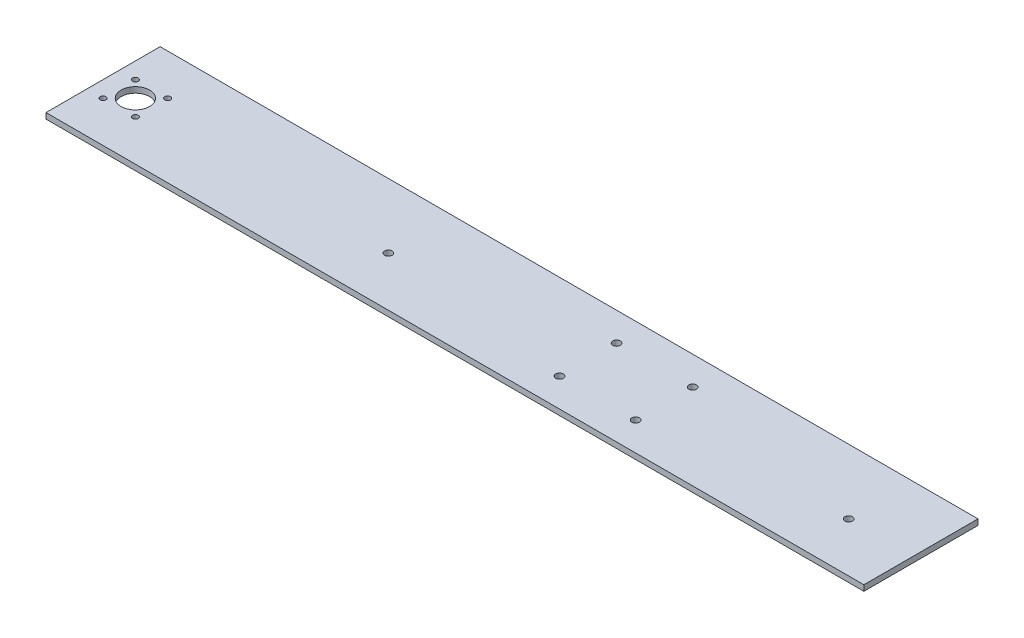
ISO-10303-21;
HEADER;
FILE_DESCRIPTION(('STEP AP214'),'2;1');
FILE_NAME('part.step','',(''),(''),'','','');
FILE_SCHEMA(('AUTOMOTIVE_DESIGN { 1 0 10303 214 1 1 1 1 }'));
ENDSEC;
DATA;
#1=APPLICATION_CONTEXT('core data for automotive mechanical design processes');
#2=APPLICATION_PROTOCOL_DEFINITION('international standard','automotive_design',2000,#1);
#3=PRODUCT_CONTEXT('',#1,'mechanical');
#4=PRODUCT('Part','Part','',(#3));
#5=PRODUCT_RELATED_PRODUCT_CATEGORY('part','',(#4));
#6=PRODUCT_DEFINITION_FORMATION('','',#4);
#7=PRODUCT_DEFINITION_CONTEXT('part definition',#1,'design');
#8=PRODUCT_DEFINITION('design','',#6,#7);
#9=PRODUCT_DEFINITION_SHAPE('','',#8);
#10=(LENGTH_UNIT() NAMED_UNIT(*) SI_UNIT(.MILLI.,.METRE.));
#11=(NAMED_UNIT(*) PLANE_ANGLE_UNIT() SI_UNIT($,.RADIAN.));
#12=(NAMED_UNIT(*) SI_UNIT($,.STERADIAN.) SOLID_ANGLE_UNIT());
#13=UNCERTAINTY_MEASURE_WITH_UNIT(LENGTH_MEASURE(1.E-05),#10,'distance_accuracy_value','');
#14=(GEOMETRIC_REPRESENTATION_CONTEXT(3) GLOBAL_UNCERTAINTY_ASSIGNED_CONTEXT((#13)) GLOBAL_UNIT_ASSIGNED_CONTEXT((#10,
#11,#12)) REPRESENTATION_CONTEXT('',''));
#15=CARTESIAN_POINT('',(0.,0.,0.));
#16=DIRECTION('',(0.,0.,1.));
#17=DIRECTION('',(1.,0.,0.));
#18=AXIS2_PLACEMENT_3D('',#15,#16,#17);
#19=CARTESIAN_POINT('',(-130.,3.,0.));
#20=DIRECTION('',(1.,0.,0.));
#21=DIRECTION('',(0.,0.,-1.));
#22=AXIS2_PLACEMENT_3D('',#19,#20,#21);
#23=PLANE('',#22);
#24=DIRECTION('',(0.,0.,1.));
#25=VECTOR('',#24,1.);
#26=CARTESIAN_POINT('',(-130.,0.,0.));
#27=LINE('',#26,#25);
#28=CARTESIAN_POINT('',(-130.,0.,-60.));
#29=VERTEX_POINT('',#28);
#30=CARTESIAN_POINT('',(-130.,0.,0.));
#31=VERTEX_POINT('',#30);
#32=EDGE_CURVE('E103',#29,#31,#27,.T.);
#33=ORIENTED_EDGE('',*,*,#32,.T.);
#34=DIRECTION('',(0.,-1.,0.));
#35=VECTOR('',#34,1.);
#36=CARTESIAN_POINT('',(-130.,3.,0.));
#37=LINE('',#36,#35);
#38=CARTESIAN_POINT('',(-130.,3.,0.));
#39=VERTEX_POINT('',#38);
#40=EDGE_CURVE('E11',#39,#31,#37,.T.);
#41=ORIENTED_EDGE('',*,*,#40,.F.);
#42=DIRECTION('',(0.,0.,1.));
#43=VECTOR('',#42,1.);
#44=CARTESIAN_POINT('',(-130.,3.,0.));
#45=LINE('',#44,#43);
#46=CARTESIAN_POINT('',(-130.,3.,-60.));
#47=VERTEX_POINT('',#46);
#48=EDGE_CURVE('E90',#47,#39,#45,.T.);
#49=ORIENTED_EDGE('',*,*,#48,.F.);
#50=DIRECTION('',(0.,-1.,0.));
#51=VECTOR('',#50,1.);
#52=CARTESIAN_POINT('',(-130.,3.,-60.));
#53=LINE('',#52,#51);
#54=EDGE_CURVE('E99',#47,#29,#53,.T.);
#55=ORIENTED_EDGE('',*,*,#54,.T.);
#56=EDGE_LOOP('',(#33,#41,#49,#55));
#57=FACE_BOUND('',#56,.T.);
#58=ADVANCED_FACE('F37',(#57),#23,.F.);
#59=CARTESIAN_POINT('',(-130.,3.,0.));
#60=DIRECTION('',(0.,0.,-1.));
#61=DIRECTION('',(-1.,0.,0.));
#62=AXIS2_PLACEMENT_3D('',#59,#60,#61);
#63=PLANE('',#62);
#64=DIRECTION('',(1.,0.,0.));
#65=VECTOR('',#64,1.);
#66=CARTESIAN_POINT('',(-130.,0.,0.));
#67=LINE('',#66,#65);
#68=CARTESIAN_POINT('',(300.,0.,0.));
#69=VERTEX_POINT('',#68);
#70=EDGE_CURVE('E94',#31,#69,#67,.T.);
#71=ORIENTED_EDGE('',*,*,#70,.T.);
#72=DIRECTION('',(0.,-1.,0.));
#73=VECTOR('',#72,1.);
#74=CARTESIAN_POINT('',(300.,3.,0.));
#75=LINE('',#74,#73);
#76=CARTESIAN_POINT('',(300.,3.,0.));
#77=VERTEX_POINT('',#76);
#78=EDGE_CURVE('E46',#77,#69,#75,.T.);
#79=ORIENTED_EDGE('',*,*,#78,.F.);
#80=DIRECTION('',(1.,0.,0.));
#81=VECTOR('',#80,1.);
#82=CARTESIAN_POINT('',(-130.,3.,0.));
#83=LINE('',#82,#81);
#84=EDGE_CURVE('E85',#39,#77,#83,.T.);
#85=ORIENTED_EDGE('',*,*,#84,.F.);
#86=ORIENTED_EDGE('',*,*,#40,.T.);
#87=EDGE_LOOP('',(#71,#79,#85,#86));
#88=FACE_BOUND('',#87,.T.);
#89=ADVANCED_FACE('F93',(#88),#63,.F.);
#90=CARTESIAN_POINT('',(300.,3.,0.));
#91=DIRECTION('',(-1.,0.,0.));
#92=DIRECTION('',(0.,0.,1.));
#93=AXIS2_PLACEMENT_3D('',#90,#91,#92);
#94=PLANE('',#93);
#95=DIRECTION('',(0.,0.,-1.));
#96=VECTOR('',#95,1.);
#97=CARTESIAN_POINT('',(300.,0.,0.));
#98=LINE('',#97,#96);
#99=CARTESIAN_POINT('',(300.,0.,-60.));
#100=VERTEX_POINT('',#99);
#101=EDGE_CURVE('E72',#69,#100,#98,.T.);
#102=ORIENTED_EDGE('',*,*,#101,.T.);
#103=DIRECTION('',(0.,-1.,0.));
#104=VECTOR('',#103,1.);
#105=CARTESIAN_POINT('',(300.,3.,-60.));
#106=LINE('',#105,#104);
#107=CARTESIAN_POINT('',(300.,3.,-60.));
#108=VERTEX_POINT('',#107);
#109=EDGE_CURVE('E95',#108,#100,#106,.T.);
#110=ORIENTED_EDGE('',*,*,#109,.F.);
#111=DIRECTION('',(0.,0.,-1.));
#112=VECTOR('',#111,1.);
#113=CARTESIAN_POINT('',(300.,3.,0.));
#114=LINE('',#113,#112);
#115=EDGE_CURVE('E88',#77,#108,#114,.T.);
#116=ORIENTED_EDGE('',*,*,#115,.F.);
#117=ORIENTED_EDGE('',*,*,#78,.T.);
#118=EDGE_LOOP('',(#102,#110,#116,#117));
#119=FACE_BOUND('',#118,.T.);
#120=ADVANCED_FACE('F97',(#119),#94,.F.);
#121=CARTESIAN_POINT('',(-130.,3.,-60.));
#122=DIRECTION('',(0.,0.,1.));
#123=DIRECTION('',(1.,0.,0.));
#124=AXIS2_PLACEMENT_3D('',#121,#122,#123);
#125=PLANE('',#124);
#126=DIRECTION('',(-1.,0.,0.));
#127=VECTOR('',#126,1.);
#128=CARTESIAN_POINT('',(-130.,0.,-60.));
#129=LINE('',#128,#127);
#130=EDGE_CURVE('E78',#100,#29,#129,.T.);
#131=ORIENTED_EDGE('',*,*,#130,.T.);
#132=ORIENTED_EDGE('',*,*,#54,.F.);
#133=DIRECTION('',(-1.,0.,0.));
#134=VECTOR('',#133,1.);
#135=CARTESIAN_POINT('',(-130.,3.,-60.));
#136=LINE('',#135,#134);
#137=EDGE_CURVE('E55',#108,#47,#136,.T.);
#138=ORIENTED_EDGE('',*,*,#137,.F.);
#139=ORIENTED_EDGE('',*,*,#109,.T.);
#140=EDGE_LOOP('',(#131,#132,#138,#139));
#141=FACE_BOUND('',#140,.T.);
#142=ADVANCED_FACE('F189',(#141),#125,.F.);
#143=CARTESIAN_POINT('',(0.,3.,0.));
#144=DIRECTION('',(0.,-1.,0.));
#145=DIRECTION('',(0.,0.,-1.));
#146=AXIS2_PLACEMENT_3D('',#143,#144,#145);
#147=PLANE('',#146);
#148=CARTESIAN_POINT('',(-121.485281374238,3.,-21.5147186257613));
#149=DIRECTION('',(0.,1.,0.));
#150=DIRECTION('',(0.,0.,1.));
#151=AXIS2_PLACEMENT_3D('',#148,#149,#150);
#152=CIRCLE('',#151,1.5);
#153=CARTESIAN_POINT('',(-121.485281374238,3.,-20.0147186257613));
#154=VERTEX_POINT('',#153);
#155=EDGE_CURVE('E136',#154,#154,#152,.T.);
#156=ORIENTED_EDGE('',*,*,#155,.F.);
#157=EDGE_LOOP('',(#156));
#158=FACE_BOUND('',#157,.T.);
#159=CARTESIAN_POINT('',(-121.485281374238,3.,-38.4852813742384));
#160=DIRECTION('',(0.,1.,0.));
#161=DIRECTION('',(0.,0.,1.));
#162=AXIS2_PLACEMENT_3D('',#159,#160,#161);
#163=CIRCLE('',#162,1.5);
#164=CARTESIAN_POINT('',(-121.485281374238,3.,-36.9852813742384));
#165=VERTEX_POINT('',#164);
#166=EDGE_CURVE('E126',#165,#165,#163,.T.);
#167=ORIENTED_EDGE('',*,*,#166,.F.);
#168=EDGE_LOOP('',(#167));
#169=FACE_BOUND('',#168,.T.);
#170=CARTESIAN_POINT('',(-104.514718625761,3.,-21.5147186257615));
#171=DIRECTION('',(0.,1.,0.));
#172=DIRECTION('',(0.,0.,1.));
#173=AXIS2_PLACEMENT_3D('',#170,#171,#172);
#174=CIRCLE('',#173,1.5);
#175=CARTESIAN_POINT('',(-104.514718625761,3.,-20.0147186257615));
#176=VERTEX_POINT('',#175);
#177=EDGE_CURVE('E123',#176,#176,#174,.T.);
#178=ORIENTED_EDGE('',*,*,#177,.F.);
#179=EDGE_LOOP('',(#178));
#180=FACE_BOUND('',#179,.T.);
#181=CARTESIAN_POINT('',(-104.514718625761,3.,-38.4852813742386));
#182=DIRECTION('',(0.,1.,0.));
#183=DIRECTION('',(0.,0.,1.));
#184=AXIS2_PLACEMENT_3D('',#181,#182,#183);
#185=CIRCLE('',#184,1.5);
#186=CARTESIAN_POINT('',(-104.514718625761,3.,-36.9852813742386));
#187=VERTEX_POINT('',#186);
#188=EDGE_CURVE('E120',#187,#187,#185,.T.);
#189=ORIENTED_EDGE('',*,*,#188,.F.);
#190=EDGE_LOOP('',(#189));
#191=FACE_BOUND('',#190,.T.);
#192=CARTESIAN_POINT('',(-113.,3.,-30.));
#193=DIRECTION('',(0.,1.,0.));
#194=DIRECTION('',(0.,0.,1.));
#195=AXIS2_PLACEMENT_3D('',#192,#193,#194);
#196=CIRCLE('',#195,7.50000000000001);
#197=CARTESIAN_POINT('',(-113.,3.,-22.5));
#198=VERTEX_POINT('',#197);
#199=EDGE_CURVE('E116',#198,#198,#196,.T.);
#200=ORIENTED_EDGE('',*,*,#199,.F.);
#201=EDGE_LOOP('',(#200));
#202=FACE_BOUND('',#201,.T.);
#203=CARTESIAN_POINT('',(266.,3.,-26.));
#204=DIRECTION('',(0.,1.,0.));
#205=DIRECTION('',(0.,0.,1.));
#206=AXIS2_PLACEMENT_3D('',#203,#204,#205);
#207=CIRCLE('',#206,2.);
#208=CARTESIAN_POINT('',(266.,3.,-24.));
#209=VERTEX_POINT('',#208);
#210=EDGE_CURVE('E115',#209,#209,#207,.T.);
#211=ORIENTED_EDGE('',*,*,#210,.F.);
#212=EDGE_LOOP('',(#211));
#213=FACE_BOUND('',#212,.T.);
#214=CARTESIAN_POINT('',(24.,3.,-26.));
#215=DIRECTION('',(0.,1.,0.));
#216=DIRECTION('',(0.,0.,1.));
#217=AXIS2_PLACEMENT_3D('',#214,#215,#216);
#218=CIRCLE('',#217,2.);
#219=CARTESIAN_POINT('',(24.,3.,-24.));
#220=VERTEX_POINT('',#219);
#221=EDGE_CURVE('E148',#220,#220,#218,.T.);
#222=ORIENTED_EDGE('',*,*,#221,.F.);
#223=EDGE_LOOP('',(#222));
#224=FACE_BOUND('',#223,.T.);
#225=CARTESIAN_POINT('',(125.,3.,-15.));
#226=DIRECTION('',(0.,1.,0.));
#227=DIRECTION('',(0.,0.,1.));
#228=AXIS2_PLACEMENT_3D('',#225,#226,#227);
#229=CIRCLE('',#228,2.);
#230=CARTESIAN_POINT('',(125.,3.,-13.));
#231=VERTEX_POINT('',#230);
#232=EDGE_CURVE('E154',#231,#231,#229,.T.);
#233=ORIENTED_EDGE('',*,*,#232,.F.);
#234=EDGE_LOOP('',(#233));
#235=FACE_BOUND('',#234,.T.);
#236=CARTESIAN_POINT('',(165.,3.,-15.));
#237=DIRECTION('',(0.,1.,0.));
#238=DIRECTION('',(0.,0.,1.));
#239=AXIS2_PLACEMENT_3D('',#236,#237,#238);
#240=CIRCLE('',#239,2.);
#241=CARTESIAN_POINT('',(165.,3.,-13.));
#242=VERTEX_POINT('',#241);
#243=EDGE_CURVE('E160',#242,#242,#240,.T.);
#244=ORIENTED_EDGE('',*,*,#243,.F.);
#245=EDGE_LOOP('',(#244));
#246=FACE_BOUND('',#245,.T.);
#247=CARTESIAN_POINT('',(165.,3.,-45.));
#248=DIRECTION('',(0.,1.,0.));
#249=DIRECTION('',(0.,0.,1.));
#250=AXIS2_PLACEMENT_3D('',#247,#248,#249);
#251=CIRCLE('',#250,2.);
#252=CARTESIAN_POINT('',(165.,3.,-43.));
#253=VERTEX_POINT('',#252);
#254=EDGE_CURVE('E166',#253,#253,#251,.T.);
#255=ORIENTED_EDGE('',*,*,#254,.F.);
#256=EDGE_LOOP('',(#255));
#257=FACE_BOUND('',#256,.T.);
#258=CARTESIAN_POINT('',(125.,3.,-45.));
#259=DIRECTION('',(0.,1.,0.));
#260=DIRECTION('',(0.,0.,1.));
#261=AXIS2_PLACEMENT_3D('',#258,#259,#260);
#262=CIRCLE('',#261,2.);
#263=CARTESIAN_POINT('',(125.,3.,-43.));
#264=VERTEX_POINT('',#263);
#265=EDGE_CURVE('E172',#264,#264,#262,.T.);
#266=ORIENTED_EDGE('',*,*,#265,.F.);
#267=EDGE_LOOP('',(#266));
#268=FACE_BOUND('',#267,.T.);
#269=ORIENTED_EDGE('',*,*,#48,.T.);
#270=ORIENTED_EDGE('',*,*,#84,.T.);
#271=ORIENTED_EDGE('',*,*,#115,.T.);
#272=ORIENTED_EDGE('',*,*,#137,.T.);
#273=EDGE_LOOP('',(#269,#270,#271,#272));
#274=FACE_BOUND('',#273,.T.);
#275=ADVANCED_FACE('F86',(#158,#169,#180,#191,#202,#213,#224,#235,#246,#257,#268,#274),#147,.F.);
#276=CARTESIAN_POINT('',(0.,0.,0.));
#277=DIRECTION('',(0.,-1.,0.));
#278=DIRECTION('',(0.,0.,-1.));
#279=AXIS2_PLACEMENT_3D('',#276,#277,#278);
#280=PLANE('',#279);
#281=CARTESIAN_POINT('',(-121.485281374238,0.,-21.5147186257613));
#282=DIRECTION('',(0.,-1.,0.));
#283=DIRECTION('',(0.,0.,-1.));
#284=AXIS2_PLACEMENT_3D('',#281,#282,#283);
#285=CIRCLE('',#284,1.5);
#286=CARTESIAN_POINT('',(-121.485281374238,0.,-23.0147186257613));
#287=VERTEX_POINT('',#286);
#288=EDGE_CURVE('E40',#287,#287,#285,.T.);
#289=ORIENTED_EDGE('',*,*,#288,.F.);
#290=EDGE_LOOP('',(#289));
#291=FACE_BOUND('',#290,.T.);
#292=CARTESIAN_POINT('',(-121.485281374238,0.,-38.4852813742384));
#293=DIRECTION('',(0.,-1.,0.));
#294=DIRECTION('',(0.,0.,-1.));
#295=AXIS2_PLACEMENT_3D('',#292,#293,#294);
#296=CIRCLE('',#295,1.5);
#297=CARTESIAN_POINT('',(-121.485281374238,0.,-39.9852813742384));
#298=VERTEX_POINT('',#297);
#299=EDGE_CURVE('E124',#298,#298,#296,.T.);
#300=ORIENTED_EDGE('',*,*,#299,.F.);
#301=EDGE_LOOP('',(#300));
#302=FACE_BOUND('',#301,.T.);
#303=CARTESIAN_POINT('',(-104.514718625761,0.,-21.5147186257615));
#304=DIRECTION('',(0.,-1.,0.));
#305=DIRECTION('',(0.,0.,-1.));
#306=AXIS2_PLACEMENT_3D('',#303,#304,#305);
#307=CIRCLE('',#306,1.5);
#308=CARTESIAN_POINT('',(-104.514718625761,0.,-23.0147186257615));
#309=VERTEX_POINT('',#308);
#310=EDGE_CURVE('E121',#309,#309,#307,.T.);
#311=ORIENTED_EDGE('',*,*,#310,.F.);
#312=EDGE_LOOP('',(#311));
#313=FACE_BOUND('',#312,.T.);
#314=CARTESIAN_POINT('',(-104.514718625761,0.,-38.4852813742386));
#315=DIRECTION('',(0.,-1.,0.));
#316=DIRECTION('',(0.,0.,-1.));
#317=AXIS2_PLACEMENT_3D('',#314,#315,#316);
#318=CIRCLE('',#317,1.5);
#319=CARTESIAN_POINT('',(-104.514718625761,0.,-39.9852813742386));
#320=VERTEX_POINT('',#319);
#321=EDGE_CURVE('E117',#320,#320,#318,.T.);
#322=ORIENTED_EDGE('',*,*,#321,.F.);
#323=EDGE_LOOP('',(#322));
#324=FACE_BOUND('',#323,.T.);
#325=CARTESIAN_POINT('',(-113.,0.,-30.));
#326=DIRECTION('',(0.,-1.,0.));
#327=DIRECTION('',(0.,0.,-1.));
#328=AXIS2_PLACEMENT_3D('',#325,#326,#327);
#329=CIRCLE('',#328,7.50000000000001);
#330=CARTESIAN_POINT('',(-113.,0.,-37.5));
#331=VERTEX_POINT('',#330);
#332=EDGE_CURVE('E112',#331,#331,#329,.T.);
#333=ORIENTED_EDGE('',*,*,#332,.F.);
#334=EDGE_LOOP('',(#333));
#335=FACE_BOUND('',#334,.T.);
#336=CARTESIAN_POINT('',(266.,0.,-26.));
#337=DIRECTION('',(0.,1.,0.));
#338=DIRECTION('',(0.,0.,1.));
#339=AXIS2_PLACEMENT_3D('',#336,#337,#338);
#340=CIRCLE('',#339,2.);
#341=CARTESIAN_POINT('',(266.,0.,-24.));
#342=VERTEX_POINT('',#341);
#343=EDGE_CURVE('E145',#342,#342,#340,.T.);
#344=ORIENTED_EDGE('',*,*,#343,.T.);
#345=EDGE_LOOP('',(#344));
#346=FACE_BOUND('',#345,.T.);
#347=CARTESIAN_POINT('',(24.,0.,-26.));
#348=DIRECTION('',(0.,1.,0.));
#349=DIRECTION('',(0.,0.,1.));
#350=AXIS2_PLACEMENT_3D('',#347,#348,#349);
#351=CIRCLE('',#350,2.);
#352=CARTESIAN_POINT('',(24.,0.,-24.));
#353=VERTEX_POINT('',#352);
#354=EDGE_CURVE('E151',#353,#353,#351,.T.);
#355=ORIENTED_EDGE('',*,*,#354,.T.);
#356=EDGE_LOOP('',(#355));
#357=FACE_BOUND('',#356,.T.);
#358=CARTESIAN_POINT('',(125.,0.,-15.));
#359=DIRECTION('',(0.,1.,0.));
#360=DIRECTION('',(0.,0.,1.));
#361=AXIS2_PLACEMENT_3D('',#358,#359,#360);
#362=CIRCLE('',#361,2.);
#363=CARTESIAN_POINT('',(125.,0.,-13.));
#364=VERTEX_POINT('',#363);
#365=EDGE_CURVE('E157',#364,#364,#362,.T.);
#366=ORIENTED_EDGE('',*,*,#365,.T.);
#367=EDGE_LOOP('',(#366));
#368=FACE_BOUND('',#367,.T.);
#369=CARTESIAN_POINT('',(165.,0.,-15.));
#370=DIRECTION('',(0.,1.,0.));
#371=DIRECTION('',(0.,0.,1.));
#372=AXIS2_PLACEMENT_3D('',#369,#370,#371);
#373=CIRCLE('',#372,2.);
#374=CARTESIAN_POINT('',(165.,0.,-13.));
#375=VERTEX_POINT('',#374);
#376=EDGE_CURVE('E163',#375,#375,#373,.T.);
#377=ORIENTED_EDGE('',*,*,#376,.T.);
#378=EDGE_LOOP('',(#377));
#379=FACE_BOUND('',#378,.T.);
#380=CARTESIAN_POINT('',(165.,0.,-45.));
#381=DIRECTION('',(0.,1.,0.));
#382=DIRECTION('',(0.,0.,1.));
#383=AXIS2_PLACEMENT_3D('',#380,#381,#382);
#384=CIRCLE('',#383,2.);
#385=CARTESIAN_POINT('',(165.,0.,-43.));
#386=VERTEX_POINT('',#385);
#387=EDGE_CURVE('E169',#386,#386,#384,.T.);
#388=ORIENTED_EDGE('',*,*,#387,.T.);
#389=EDGE_LOOP('',(#388));
#390=FACE_BOUND('',#389,.T.);
#391=CARTESIAN_POINT('',(125.,0.,-45.));
#392=DIRECTION('',(0.,1.,0.));
#393=DIRECTION('',(0.,0.,1.));
#394=AXIS2_PLACEMENT_3D('',#391,#392,#393);
#395=CIRCLE('',#394,2.);
#396=CARTESIAN_POINT('',(125.,0.,-43.));
#397=VERTEX_POINT('',#396);
#398=EDGE_CURVE('E106',#397,#397,#395,.T.);
#399=ORIENTED_EDGE('',*,*,#398,.T.);
#400=EDGE_LOOP('',(#399));
#401=FACE_BOUND('',#400,.T.);
#402=ORIENTED_EDGE('',*,*,#32,.F.);
#403=ORIENTED_EDGE('',*,*,#130,.F.);
#404=ORIENTED_EDGE('',*,*,#101,.F.);
#405=ORIENTED_EDGE('',*,*,#70,.F.);
#406=EDGE_LOOP('',(#402,#403,#404,#405));
#407=FACE_BOUND('',#406,.T.);
#408=ADVANCED_FACE('F178',(#291,#302,#313,#324,#335,#346,#357,#368,#379,#390,#401,#407),#280,.T.);
#409=CARTESIAN_POINT('',(125.,3.,-45.));
#410=DIRECTION('',(0.,1.,0.));
#411=DIRECTION('',(0.,0.,1.));
#412=AXIS2_PLACEMENT_3D('',#409,#410,#411);
#413=CYLINDRICAL_SURFACE('',#412,2.);
#414=ORIENTED_EDGE('',*,*,#398,.F.);
#415=EDGE_LOOP('',(#414));
#416=FACE_BOUND('',#415,.T.);
#417=ORIENTED_EDGE('',*,*,#265,.T.);
#418=EDGE_LOOP('',(#417));
#419=FACE_BOUND('',#418,.T.);
#420=ADVANCED_FACE('F181',(#416,#419),#413,.F.);
#421=CARTESIAN_POINT('',(165.,3.,-45.));
#422=DIRECTION('',(0.,1.,0.));
#423=DIRECTION('',(0.,0.,1.));
#424=AXIS2_PLACEMENT_3D('',#421,#422,#423);
#425=CYLINDRICAL_SURFACE('',#424,2.);
#426=ORIENTED_EDGE('',*,*,#387,.F.);
#427=EDGE_LOOP('',(#426));
#428=FACE_BOUND('',#427,.T.);
#429=ORIENTED_EDGE('',*,*,#254,.T.);
#430=EDGE_LOOP('',(#429));
#431=FACE_BOUND('',#430,.T.);
#432=ADVANCED_FACE('F184',(#428,#431),#425,.F.);
#433=CARTESIAN_POINT('',(165.,3.,-15.));
#434=DIRECTION('',(0.,1.,0.));
#435=DIRECTION('',(0.,0.,1.));
#436=AXIS2_PLACEMENT_3D('',#433,#434,#435);
#437=CYLINDRICAL_SURFACE('',#436,2.);
#438=ORIENTED_EDGE('',*,*,#376,.F.);
#439=EDGE_LOOP('',(#438));
#440=FACE_BOUND('',#439,.T.);
#441=ORIENTED_EDGE('',*,*,#243,.T.);
#442=EDGE_LOOP('',(#441));
#443=FACE_BOUND('',#442,.T.);
#444=ADVANCED_FACE('F234',(#440,#443),#437,.F.);
#445=CARTESIAN_POINT('',(125.,3.,-15.));
#446=DIRECTION('',(0.,1.,0.));
#447=DIRECTION('',(0.,0.,1.));
#448=AXIS2_PLACEMENT_3D('',#445,#446,#447);
#449=CYLINDRICAL_SURFACE('',#448,2.);
#450=ORIENTED_EDGE('',*,*,#365,.F.);
#451=EDGE_LOOP('',(#450));
#452=FACE_BOUND('',#451,.T.);
#453=ORIENTED_EDGE('',*,*,#232,.T.);
#454=EDGE_LOOP('',(#453));
#455=FACE_BOUND('',#454,.T.);
#456=ADVANCED_FACE('F244',(#452,#455),#449,.F.);
#457=CARTESIAN_POINT('',(24.,3.,-26.));
#458=DIRECTION('',(0.,1.,0.));
#459=DIRECTION('',(0.,0.,1.));
#460=AXIS2_PLACEMENT_3D('',#457,#458,#459);
#461=CYLINDRICAL_SURFACE('',#460,2.);
#462=ORIENTED_EDGE('',*,*,#354,.F.);
#463=EDGE_LOOP('',(#462));
#464=FACE_BOUND('',#463,.T.);
#465=ORIENTED_EDGE('',*,*,#221,.T.);
#466=EDGE_LOOP('',(#465));
#467=FACE_BOUND('',#466,.T.);
#468=ADVANCED_FACE('F254',(#464,#467),#461,.F.);
#469=CARTESIAN_POINT('',(266.,3.,-26.));
#470=DIRECTION('',(0.,1.,0.));
#471=DIRECTION('',(0.,0.,1.));
#472=AXIS2_PLACEMENT_3D('',#469,#470,#471);
#473=CYLINDRICAL_SURFACE('',#472,2.);
#474=ORIENTED_EDGE('',*,*,#343,.F.);
#475=EDGE_LOOP('',(#474));
#476=FACE_BOUND('',#475,.T.);
#477=ORIENTED_EDGE('',*,*,#210,.T.);
#478=EDGE_LOOP('',(#477));
#479=FACE_BOUND('',#478,.T.);
#480=ADVANCED_FACE('F264',(#476,#479),#473,.F.);
#481=CARTESIAN_POINT('',(-113.,-2.,-30.));
#482=DIRECTION('',(0.,1.,0.));
#483=DIRECTION('',(0.,0.,1.));
#484=AXIS2_PLACEMENT_3D('',#481,#482,#483);
#485=CYLINDRICAL_SURFACE('',#484,7.50000000000001);
#486=ORIENTED_EDGE('',*,*,#332,.T.);
#487=EDGE_LOOP('',(#486));
#488=FACE_BOUND('',#487,.T.);
#489=ORIENTED_EDGE('',*,*,#199,.T.);
#490=EDGE_LOOP('',(#489));
#491=FACE_BOUND('',#490,.T.);
#492=ADVANCED_FACE('F274',(#488,#491),#485,.F.);
#493=CARTESIAN_POINT('',(-104.514718625761,3.,-38.4852813742386));
#494=DIRECTION('',(0.,1.,0.));
#495=DIRECTION('',(0.,0.,1.));
#496=AXIS2_PLACEMENT_3D('',#493,#494,#495);
#497=CYLINDRICAL_SURFACE('',#496,1.5);
#498=ORIENTED_EDGE('',*,*,#321,.T.);
#499=EDGE_LOOP('',(#498));
#500=FACE_BOUND('',#499,.T.);
#501=ORIENTED_EDGE('',*,*,#188,.T.);
#502=EDGE_LOOP('',(#501));
#503=FACE_BOUND('',#502,.T.);
#504=ADVANCED_FACE('F283',(#500,#503),#497,.F.);
#505=CARTESIAN_POINT('',(-104.514718625761,3.,-21.5147186257615));
#506=DIRECTION('',(0.,1.,0.));
#507=DIRECTION('',(0.,0.,1.));
#508=AXIS2_PLACEMENT_3D('',#505,#506,#507);
#509=CYLINDRICAL_SURFACE('',#508,1.5);
#510=ORIENTED_EDGE('',*,*,#310,.T.);
#511=EDGE_LOOP('',(#510));
#512=FACE_BOUND('',#511,.T.);
#513=ORIENTED_EDGE('',*,*,#177,.T.);
#514=EDGE_LOOP('',(#513));
#515=FACE_BOUND('',#514,.T.);
#516=ADVANCED_FACE('F302',(#512,#515),#509,.F.);
#517=CARTESIAN_POINT('',(-121.485281374238,3.,-38.4852813742384));
#518=DIRECTION('',(0.,1.,0.));
#519=DIRECTION('',(0.,0.,1.));
#520=AXIS2_PLACEMENT_3D('',#517,#518,#519);
#521=CYLINDRICAL_SURFACE('',#520,1.5);
#522=ORIENTED_EDGE('',*,*,#299,.T.);
#523=EDGE_LOOP('',(#522));
#524=FACE_BOUND('',#523,.T.);
#525=ORIENTED_EDGE('',*,*,#166,.T.);
#526=EDGE_LOOP('',(#525));
#527=FACE_BOUND('',#526,.T.);
#528=ADVANCED_FACE('F312',(#524,#527),#521,.F.);
#529=CARTESIAN_POINT('',(-121.485281374238,3.,-21.5147186257613));
#530=DIRECTION('',(0.,1.,0.));
#531=DIRECTION('',(0.,0.,1.));
#532=AXIS2_PLACEMENT_3D('',#529,#530,#531);
#533=CYLINDRICAL_SURFACE('',#532,1.5);
#534=ORIENTED_EDGE('',*,*,#288,.T.);
#535=EDGE_LOOP('',(#534));
#536=FACE_BOUND('',#535,.T.);
#537=ORIENTED_EDGE('',*,*,#155,.T.);
#538=EDGE_LOOP('',(#537));
#539=FACE_BOUND('',#538,.T.);
#540=ADVANCED_FACE('F322',(#536,#539),#533,.F.);
#541=CLOSED_SHELL('',(#58,#89,#120,#142,#275,#408,#420,#432,#444,#456,#468,#480,#492,#504,#516,
#528,#540));
#542=MANIFOLD_SOLID_BREP('B2',#541);
#543=ADVANCED_BREP_SHAPE_REPRESENTATION('',(#18,#542),#14);
#544=SHAPE_DEFINITION_REPRESENTATION(#9,#543);
ENDSEC;
END-ISO-10303-21;
